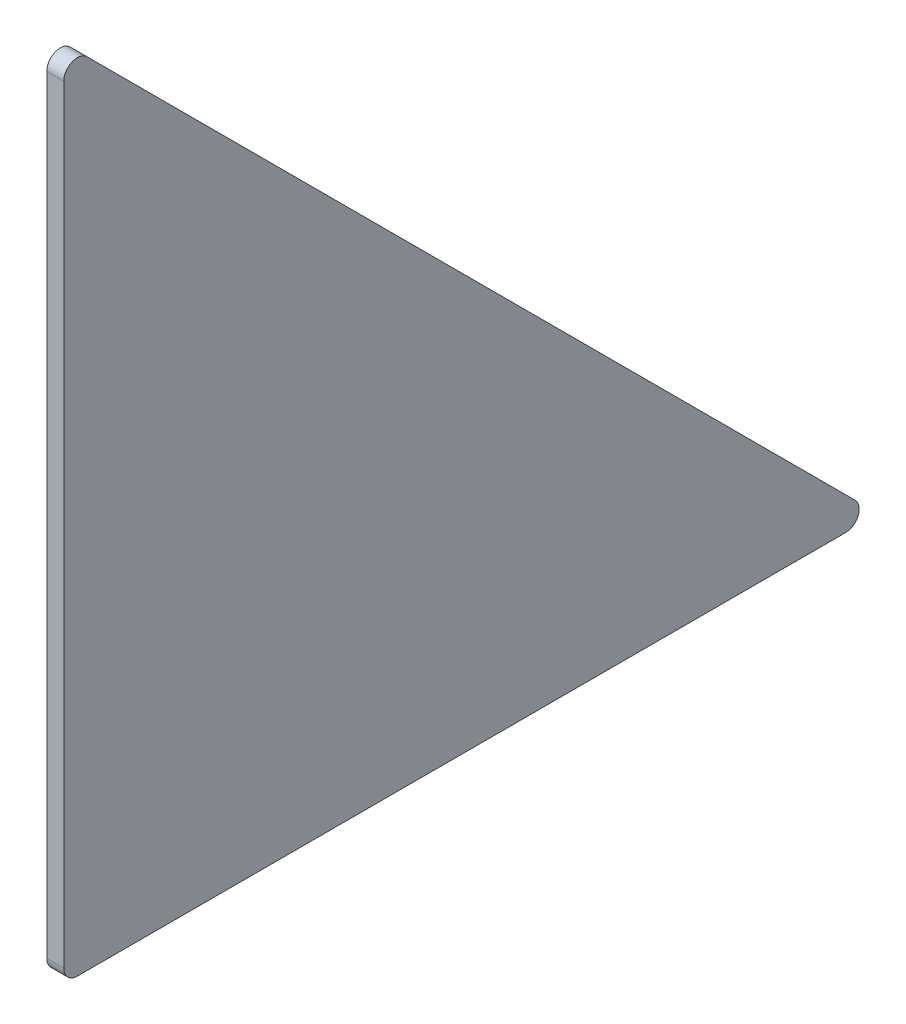
ISO-10303-21;
HEADER;
FILE_DESCRIPTION(('STEP AP214'),'2;1');
FILE_NAME('part.step','',(''),(''),'','','');
FILE_SCHEMA(('AUTOMOTIVE_DESIGN { 1 0 10303 214 1 1 1 1 }'));
ENDSEC;
DATA;
#1=APPLICATION_CONTEXT('core data for automotive mechanical design processes');
#2=APPLICATION_PROTOCOL_DEFINITION('international standard','automotive_design',2000,#1);
#3=PRODUCT_CONTEXT('',#1,'mechanical');
#4=PRODUCT('Part','Part','',(#3));
#5=PRODUCT_RELATED_PRODUCT_CATEGORY('part','',(#4));
#6=PRODUCT_DEFINITION_FORMATION('','',#4);
#7=PRODUCT_DEFINITION_CONTEXT('part definition',#1,'design');
#8=PRODUCT_DEFINITION('design','',#6,#7);
#9=PRODUCT_DEFINITION_SHAPE('','',#8);
#10=(LENGTH_UNIT() NAMED_UNIT(*) SI_UNIT(.MILLI.,.METRE.));
#11=(NAMED_UNIT(*) PLANE_ANGLE_UNIT() SI_UNIT($,.RADIAN.));
#12=(NAMED_UNIT(*) SI_UNIT($,.STERADIAN.) SOLID_ANGLE_UNIT());
#13=UNCERTAINTY_MEASURE_WITH_UNIT(LENGTH_MEASURE(1.E-05),#10,'distance_accuracy_value','');
#14=(GEOMETRIC_REPRESENTATION_CONTEXT(3) GLOBAL_UNCERTAINTY_ASSIGNED_CONTEXT((#13)) GLOBAL_UNIT_ASSIGNED_CONTEXT((#10,
#11,#12)) REPRESENTATION_CONTEXT('',''));
#15=CARTESIAN_POINT('',(0.,0.,0.));
#16=DIRECTION('',(0.,0.,1.));
#17=DIRECTION('',(1.,0.,0.));
#18=AXIS2_PLACEMENT_3D('',#15,#16,#17);
#19=CARTESIAN_POINT('',(3.175,0.,-152.4));
#20=DIRECTION('',(0.,1.,0.));
#21=DIRECTION('',(0.,0.,1.));
#22=AXIS2_PLACEMENT_3D('',#19,#20,#21);
#23=PLANE('',#22);
#24=DIRECTION('',(0.,0.,-1.));
#25=VECTOR('',#24,1.);
#26=CARTESIAN_POINT('',(0.,0.,-152.4));
#27=LINE('',#26,#25);
#28=CARTESIAN_POINT('',(0.,0.,-2.54000000000004));
#29=VERTEX_POINT('',#28);
#30=CARTESIAN_POINT('',(0.,0.,-146.267897551572));
#31=VERTEX_POINT('',#30);
#32=EDGE_CURVE('E122',#29,#31,#27,.T.);
#33=ORIENTED_EDGE('',*,*,#32,.T.);
#34=DIRECTION('',(-1.,0.,0.));
#35=VECTOR('',#34,1.);
#36=CARTESIAN_POINT('',(3.175,0.,-146.267897551572));
#37=LINE('',#36,#35);
#38=CARTESIAN_POINT('',(3.175,0.,-146.267897551572));
#39=VERTEX_POINT('',#38);
#40=EDGE_CURVE('E98',#31,#39,#37,.F.);
#41=ORIENTED_EDGE('',*,*,#40,.T.);
#42=DIRECTION('',(0.,0.,-1.));
#43=VECTOR('',#42,1.);
#44=CARTESIAN_POINT('',(3.175,0.,-152.4));
#45=LINE('',#44,#43);
#46=CARTESIAN_POINT('',(3.175,0.,-2.54000000000004));
#47=VERTEX_POINT('',#46);
#48=EDGE_CURVE('E126',#47,#39,#45,.T.);
#49=ORIENTED_EDGE('',*,*,#48,.F.);
#50=DIRECTION('',(-1.,0.,0.));
#51=VECTOR('',#50,1.);
#52=CARTESIAN_POINT('',(3.175,0.,-2.53999999999999));
#53=LINE('',#52,#51);
#54=EDGE_CURVE('E104',#47,#29,#53,.T.);
#55=ORIENTED_EDGE('',*,*,#54,.T.);
#56=EDGE_LOOP('',(#33,#41,#49,#55));
#57=FACE_BOUND('',#56,.T.);
#58=ADVANCED_FACE('F39',(#57),#23,.F.);
#59=CARTESIAN_POINT('',(3.175,152.4,0.));
#60=DIRECTION('',(0.,-0.707106781186548,0.707106781186548));
#61=DIRECTION('',(0.,-0.707106781186548,-0.707106781186548));
#62=AXIS2_PLACEMENT_3D('',#59,#60,#61);
#63=PLANE('',#62);
#64=DIRECTION('',(0.,0.707106781186547,0.707106781186547));
#65=VECTOR('',#64,1.);
#66=CARTESIAN_POINT('',(3.175,152.4,0.));
#67=LINE('',#66,#65);
#68=CARTESIAN_POINT('',(3.175,4.33605122421385,-148.063948775786));
#69=VERTEX_POINT('',#68);
#70=CARTESIAN_POINT('',(3.175,148.063948775786,-4.33605122421382));
#71=VERTEX_POINT('',#70);
#72=EDGE_CURVE('E113',#69,#71,#67,.T.);
#73=ORIENTED_EDGE('',*,*,#72,.F.);
#74=DIRECTION('',(-1.,0.,0.));
#75=VECTOR('',#74,1.);
#76=CARTESIAN_POINT('',(3.175,4.33605122421385,-148.063948775786));
#77=LINE('',#76,#75);
#78=CARTESIAN_POINT('',(0.,4.33605122421385,-148.063948775786));
#79=VERTEX_POINT('',#78);
#80=EDGE_CURVE('E97',#69,#79,#77,.T.);
#81=ORIENTED_EDGE('',*,*,#80,.T.);
#82=DIRECTION('',(0.,0.707106781186547,0.707106781186547));
#83=VECTOR('',#82,1.);
#84=CARTESIAN_POINT('',(0.,152.4,0.));
#85=LINE('',#84,#83);
#86=CARTESIAN_POINT('',(0.,148.063948775786,-4.33605122421382));
#87=VERTEX_POINT('',#86);
#88=EDGE_CURVE('E111',#79,#87,#85,.T.);
#89=ORIENTED_EDGE('',*,*,#88,.T.);
#90=DIRECTION('',(-1.,0.,0.));
#91=VECTOR('',#90,1.);
#92=CARTESIAN_POINT('',(3.175,148.063948775786,-4.33605122421382));
#93=LINE('',#92,#91);
#94=EDGE_CURVE('E116',#87,#71,#93,.F.);
#95=ORIENTED_EDGE('',*,*,#94,.T.);
#96=EDGE_LOOP('',(#73,#81,#89,#95));
#97=FACE_BOUND('',#96,.T.);
#98=ADVANCED_FACE('F110',(#97),#63,.F.);
#99=CARTESIAN_POINT('',(3.175,0.,0.));
#100=DIRECTION('',(0.,0.,-1.));
#101=DIRECTION('',(-1.,0.,0.));
#102=AXIS2_PLACEMENT_3D('',#99,#100,#101);
#103=PLANE('',#102);
#104=DIRECTION('',(0.,-1.,0.));
#105=VECTOR('',#104,1.);
#106=CARTESIAN_POINT('',(0.,0.,0.));
#107=LINE('',#106,#105);
#108=CARTESIAN_POINT('',(0.,146.267897551572,0.));
#109=VERTEX_POINT('',#108);
#110=CARTESIAN_POINT('',(0.,2.54,0.));
#111=VERTEX_POINT('',#110);
#112=EDGE_CURVE('E121',#109,#111,#107,.T.);
#113=ORIENTED_EDGE('',*,*,#112,.T.);
#114=DIRECTION('',(-1.,0.,0.));
#115=VECTOR('',#114,1.);
#116=CARTESIAN_POINT('',(3.175,2.54,0.));
#117=LINE('',#116,#115);
#118=CARTESIAN_POINT('',(3.175,2.54,0.));
#119=VERTEX_POINT('',#118);
#120=EDGE_CURVE('E11',#111,#119,#117,.F.);
#121=ORIENTED_EDGE('',*,*,#120,.T.);
#122=DIRECTION('',(0.,-1.,0.));
#123=VECTOR('',#122,1.);
#124=CARTESIAN_POINT('',(3.175,0.,0.));
#125=LINE('',#124,#123);
#126=CARTESIAN_POINT('',(3.175,146.267897551572,0.));
#127=VERTEX_POINT('',#126);
#128=EDGE_CURVE('E132',#127,#119,#125,.T.);
#129=ORIENTED_EDGE('',*,*,#128,.F.);
#130=DIRECTION('',(-1.,0.,0.));
#131=VECTOR('',#130,1.);
#132=CARTESIAN_POINT('',(3.175,146.267897551572,0.));
#133=LINE('',#132,#131);
#134=EDGE_CURVE('E48',#127,#109,#133,.T.);
#135=ORIENTED_EDGE('',*,*,#134,.T.);
#136=EDGE_LOOP('',(#113,#121,#129,#135));
#137=FACE_BOUND('',#136,.T.);
#138=ADVANCED_FACE('F153',(#137),#103,.F.);
#139=CARTESIAN_POINT('',(3.175,0.,0.));
#140=DIRECTION('',(-1.,0.,0.));
#141=DIRECTION('',(0.,0.,1.));
#142=AXIS2_PLACEMENT_3D('',#139,#140,#141);
#143=PLANE('',#142);
#144=ORIENTED_EDGE('',*,*,#48,.T.);
#145=CARTESIAN_POINT('',(3.175,2.53999999999999,-146.267897551572));
#146=DIRECTION('',(-1.,0.,0.));
#147=DIRECTION('',(0.,0.,1.));
#148=AXIS2_PLACEMENT_3D('',#145,#146,#147);
#149=CIRCLE('',#148,2.54);
#150=EDGE_CURVE('E148',#39,#69,#149,.F.);
#151=ORIENTED_EDGE('',*,*,#150,.T.);
#152=ORIENTED_EDGE('',*,*,#72,.T.);
#153=CARTESIAN_POINT('',(3.175,146.267897551572,-2.54));
#154=DIRECTION('',(-1.,0.,0.));
#155=DIRECTION('',(0.,0.,1.));
#156=AXIS2_PLACEMENT_3D('',#153,#154,#155);
#157=CIRCLE('',#156,2.54);
#158=EDGE_CURVE('E60',#71,#127,#157,.F.);
#159=ORIENTED_EDGE('',*,*,#158,.T.);
#160=ORIENTED_EDGE('',*,*,#128,.T.);
#161=CARTESIAN_POINT('',(3.175,2.54,-2.53999999999999));
#162=DIRECTION('',(-1.,0.,0.));
#163=DIRECTION('',(0.,0.,1.));
#164=AXIS2_PLACEMENT_3D('',#161,#162,#163);
#165=CIRCLE('',#164,2.54);
#166=EDGE_CURVE('E145',#119,#47,#165,.F.);
#167=ORIENTED_EDGE('',*,*,#166,.T.);
#168=EDGE_LOOP('',(#144,#151,#152,#159,#160,#167));
#169=FACE_BOUND('',#168,.T.);
#170=ADVANCED_FACE('F167',(#169),#143,.F.);
#171=CARTESIAN_POINT('',(0.,0.,0.));
#172=DIRECTION('',(-1.,0.,0.));
#173=DIRECTION('',(0.,0.,1.));
#174=AXIS2_PLACEMENT_3D('',#171,#172,#173);
#175=PLANE('',#174);
#176=ORIENTED_EDGE('',*,*,#88,.F.);
#177=CARTESIAN_POINT('',(0.,2.53999999999999,-146.267897551572));
#178=DIRECTION('',(-1.,0.,0.));
#179=DIRECTION('',(0.,0.,1.));
#180=AXIS2_PLACEMENT_3D('',#177,#178,#179);
#181=CIRCLE('',#180,2.54);
#182=EDGE_CURVE('E93',#79,#31,#181,.T.);
#183=ORIENTED_EDGE('',*,*,#182,.T.);
#184=ORIENTED_EDGE('',*,*,#32,.F.);
#185=CARTESIAN_POINT('',(0.,2.54,-2.53999999999999));
#186=DIRECTION('',(-1.,0.,0.));
#187=DIRECTION('',(0.,0.,1.));
#188=AXIS2_PLACEMENT_3D('',#185,#186,#187);
#189=CIRCLE('',#188,2.54);
#190=EDGE_CURVE('E105',#29,#111,#189,.T.);
#191=ORIENTED_EDGE('',*,*,#190,.T.);
#192=ORIENTED_EDGE('',*,*,#112,.F.);
#193=CARTESIAN_POINT('',(0.,146.267897551572,-2.54));
#194=DIRECTION('',(-1.,0.,0.));
#195=DIRECTION('',(0.,0.,1.));
#196=AXIS2_PLACEMENT_3D('',#193,#194,#195);
#197=CIRCLE('',#196,2.54);
#198=EDGE_CURVE('E115',#109,#87,#197,.T.);
#199=ORIENTED_EDGE('',*,*,#198,.T.);
#200=EDGE_LOOP('',(#176,#183,#184,#191,#192,#199));
#201=FACE_BOUND('',#200,.T.);
#202=ADVANCED_FACE('F118',(#201),#175,.T.);
#203=CARTESIAN_POINT('',(3.175,2.53999999999999,-146.267897551572));
#204=DIRECTION('',(-1.,0.,0.));
#205=DIRECTION('',(0.,0.,1.));
#206=AXIS2_PLACEMENT_3D('',#203,#204,#205);
#207=CYLINDRICAL_SURFACE('',#206,2.54);
#208=ORIENTED_EDGE('',*,*,#150,.F.);
#209=ORIENTED_EDGE('',*,*,#40,.F.);
#210=ORIENTED_EDGE('',*,*,#182,.F.);
#211=ORIENTED_EDGE('',*,*,#80,.F.);
#212=EDGE_LOOP('',(#208,#209,#210,#211));
#213=FACE_BOUND('',#212,.T.);
#214=ADVANCED_FACE('F96',(#213),#207,.T.);
#215=CARTESIAN_POINT('',(3.175,2.54,-2.53999999999999));
#216=DIRECTION('',(-1.,0.,0.));
#217=DIRECTION('',(0.,0.,1.));
#218=AXIS2_PLACEMENT_3D('',#215,#216,#217);
#219=CYLINDRICAL_SURFACE('',#218,2.54);
#220=ORIENTED_EDGE('',*,*,#166,.F.);
#221=ORIENTED_EDGE('',*,*,#120,.F.);
#222=ORIENTED_EDGE('',*,*,#190,.F.);
#223=ORIENTED_EDGE('',*,*,#54,.F.);
#224=EDGE_LOOP('',(#220,#221,#222,#223));
#225=FACE_BOUND('',#224,.T.);
#226=ADVANCED_FACE('F158',(#225),#219,.T.);
#227=CARTESIAN_POINT('',(3.175,146.267897551572,-2.54));
#228=DIRECTION('',(-1.,0.,0.));
#229=DIRECTION('',(0.,0.,1.));
#230=AXIS2_PLACEMENT_3D('',#227,#228,#229);
#231=CYLINDRICAL_SURFACE('',#230,2.54);
#232=ORIENTED_EDGE('',*,*,#158,.F.);
#233=ORIENTED_EDGE('',*,*,#94,.F.);
#234=ORIENTED_EDGE('',*,*,#198,.F.);
#235=ORIENTED_EDGE('',*,*,#134,.F.);
#236=EDGE_LOOP('',(#232,#233,#234,#235));
#237=FACE_BOUND('',#236,.T.);
#238=ADVANCED_FACE('F41',(#237),#231,.T.);
#239=CLOSED_SHELL('',(#58,#98,#138,#170,#202,#214,#226,#238));
#240=MANIFOLD_SOLID_BREP('B2',#239);
#241=ADVANCED_BREP_SHAPE_REPRESENTATION('',(#18,#240),#14);
#242=SHAPE_DEFINITION_REPRESENTATION(#9,#241);
ENDSEC;
END-ISO-10303-21;
